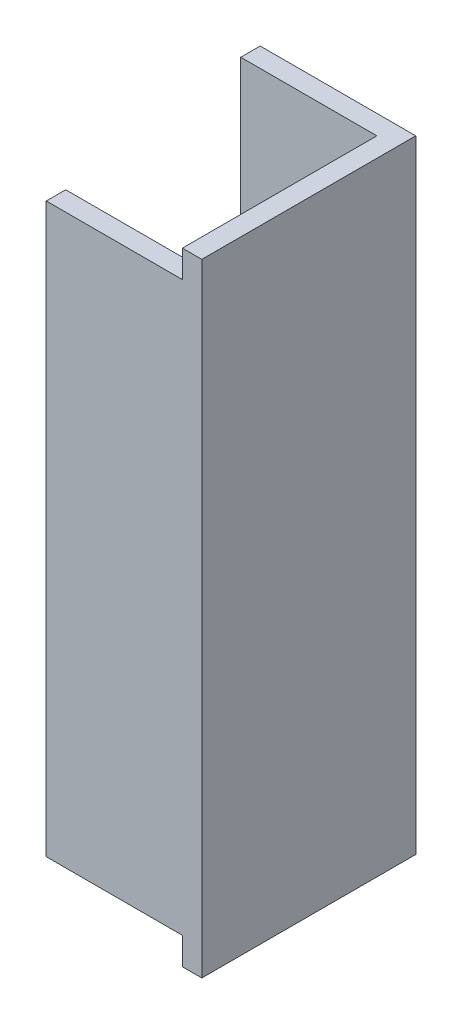
ISO-10303-21;
HEADER;
FILE_DESCRIPTION(('STEP AP214'),'2;1');
FILE_NAME('part.step','',(''),(''),'','','');
FILE_SCHEMA(('AUTOMOTIVE_DESIGN { 1 0 10303 214 1 1 1 1 }'));
ENDSEC;
DATA;
#1=APPLICATION_CONTEXT('core data for automotive mechanical design processes');
#2=APPLICATION_PROTOCOL_DEFINITION('international standard','automotive_design',2000,#1);
#3=PRODUCT_CONTEXT('',#1,'mechanical');
#4=PRODUCT('Part','Part','',(#3));
#5=PRODUCT_RELATED_PRODUCT_CATEGORY('part','',(#4));
#6=PRODUCT_DEFINITION_FORMATION('','',#4);
#7=PRODUCT_DEFINITION_CONTEXT('part definition',#1,'design');
#8=PRODUCT_DEFINITION('design','',#6,#7);
#9=PRODUCT_DEFINITION_SHAPE('','',#8);
#10=(LENGTH_UNIT() NAMED_UNIT(*) SI_UNIT(.MILLI.,.METRE.));
#11=(NAMED_UNIT(*) PLANE_ANGLE_UNIT() SI_UNIT($,.RADIAN.));
#12=(NAMED_UNIT(*) SI_UNIT($,.STERADIAN.) SOLID_ANGLE_UNIT());
#13=UNCERTAINTY_MEASURE_WITH_UNIT(LENGTH_MEASURE(1.E-05),#10,'distance_accuracy_value','');
#14=(GEOMETRIC_REPRESENTATION_CONTEXT(3) GLOBAL_UNCERTAINTY_ASSIGNED_CONTEXT((#13)) GLOBAL_UNIT_ASSIGNED_CONTEXT((#10,
#11,#12)) REPRESENTATION_CONTEXT('',''));
#15=CARTESIAN_POINT('',(0.,0.,0.));
#16=DIRECTION('',(0.,0.,1.));
#17=DIRECTION('',(1.,0.,0.));
#18=AXIS2_PLACEMENT_3D('',#15,#16,#17);
#19=CARTESIAN_POINT('',(1.55,-0.8,0.5));
#20=DIRECTION('',(0.,0.,1.));
#21=DIRECTION('',(1.,0.,0.));
#22=AXIS2_PLACEMENT_3D('',#19,#20,#21);
#23=PLANE('',#22);
#24=DIRECTION('',(0.,-1.,0.));
#25=VECTOR('',#24,1.);
#26=CARTESIAN_POINT('',(1.2,0.73,0.5));
#27=LINE('',#26,#25);
#28=CARTESIAN_POINT('',(1.2,0.73,0.5));
#29=VERTEX_POINT('',#28);
#30=CARTESIAN_POINT('',(1.2,-0.73,0.5));
#31=VERTEX_POINT('',#30);
#32=EDGE_CURVE('E11',#29,#31,#27,.T.);
#33=ORIENTED_EDGE('',*,*,#32,.F.);
#34=DIRECTION('',(1.,0.,0.));
#35=VECTOR('',#34,1.);
#36=CARTESIAN_POINT('',(1.2,0.73,0.5));
#37=LINE('',#36,#35);
#38=CARTESIAN_POINT('',(1.55,0.73,0.5));
#39=VERTEX_POINT('',#38);
#40=EDGE_CURVE('E183',#29,#39,#37,.T.);
#41=ORIENTED_EDGE('',*,*,#40,.T.);
#42=DIRECTION('',(0.,-1.,0.));
#43=VECTOR('',#42,1.);
#44=CARTESIAN_POINT('',(1.55,0.73,0.5));
#45=LINE('',#44,#43);
#46=CARTESIAN_POINT('',(1.55,-0.73,0.5));
#47=VERTEX_POINT('',#46);
#48=EDGE_CURVE('E133',#39,#47,#45,.T.);
#49=ORIENTED_EDGE('',*,*,#48,.T.);
#50=DIRECTION('',(-1.,0.,0.));
#51=VECTOR('',#50,1.);
#52=CARTESIAN_POINT('',(1.55,-0.73,0.5));
#53=LINE('',#52,#51);
#54=EDGE_CURVE('E157',#47,#31,#53,.T.);
#55=ORIENTED_EDGE('',*,*,#54,.T.);
#56=EDGE_LOOP('',(#33,#41,#49,#55));
#57=FACE_BOUND('',#56,.T.);
#58=ADVANCED_FACE('F17',(#57),#23,.F.);
#59=CARTESIAN_POINT('',(1.2,-0.8,0.5));
#60=DIRECTION('',(-1.,0.,0.));
#61=DIRECTION('',(0.,0.,1.));
#62=AXIS2_PLACEMENT_3D('',#59,#60,#61);
#63=PLANE('',#62);
#64=DIRECTION('',(0.,0.,-1.));
#65=VECTOR('',#64,1.);
#66=CARTESIAN_POINT('',(1.2,-0.73,0.55));
#67=LINE('',#66,#65);
#68=CARTESIAN_POINT('',(1.2,-0.73,0.55));
#69=VERTEX_POINT('',#68);
#70=EDGE_CURVE('E239',#69,#31,#67,.T.);
#71=ORIENTED_EDGE('',*,*,#70,.F.);
#72=DIRECTION('',(0.,-1.,0.));
#73=VECTOR('',#72,1.);
#74=CARTESIAN_POINT('',(1.2,0.73,0.55));
#75=LINE('',#74,#73);
#76=CARTESIAN_POINT('',(1.2,0.73,0.55));
#77=VERTEX_POINT('',#76);
#78=EDGE_CURVE('E179',#77,#69,#75,.T.);
#79=ORIENTED_EDGE('',*,*,#78,.F.);
#80=DIRECTION('',(0.,0.,-1.));
#81=VECTOR('',#80,1.);
#82=CARTESIAN_POINT('',(1.2,0.73,0.55));
#83=LINE('',#82,#81);
#84=EDGE_CURVE('E26',#77,#29,#83,.T.);
#85=ORIENTED_EDGE('',*,*,#84,.T.);
#86=ORIENTED_EDGE('',*,*,#32,.T.);
#87=EDGE_LOOP('',(#71,#79,#85,#86));
#88=FACE_BOUND('',#87,.T.);
#89=ADVANCED_FACE('F19',(#88),#63,.T.);
#90=CARTESIAN_POINT('',(1.2,0.73,0.5));
#91=DIRECTION('',(0.,-1.,0.));
#92=DIRECTION('',(0.,0.,-1.));
#93=AXIS2_PLACEMENT_3D('',#90,#91,#92);
#94=PLANE('',#93);
#95=DIRECTION('',(1.,0.,0.));
#96=VECTOR('',#95,1.);
#97=CARTESIAN_POINT('',(1.2,0.73,0.55));
#98=LINE('',#97,#96);
#99=CARTESIAN_POINT('',(1.55,0.73,0.55));
#100=VERTEX_POINT('',#99);
#101=EDGE_CURVE('E177',#77,#100,#98,.T.);
#102=ORIENTED_EDGE('',*,*,#101,.T.);
#103=DIRECTION('',(0.,0.,-1.));
#104=VECTOR('',#103,1.);
#105=CARTESIAN_POINT('',(1.55,0.73,0.55));
#106=LINE('',#105,#104);
#107=EDGE_CURVE('E164',#100,#39,#106,.T.);
#108=ORIENTED_EDGE('',*,*,#107,.T.);
#109=ORIENTED_EDGE('',*,*,#40,.F.);
#110=ORIENTED_EDGE('',*,*,#84,.F.);
#111=EDGE_LOOP('',(#102,#108,#109,#110));
#112=FACE_BOUND('',#111,.T.);
#113=ADVANCED_FACE('F270',(#112),#94,.F.);
#114=CARTESIAN_POINT('',(1.2,-0.8,0.05));
#115=DIRECTION('',(1.,0.,0.));
#116=DIRECTION('',(0.,1.,0.));
#117=AXIS2_PLACEMENT_3D('',#114,#115,#116);
#118=PLANE('',#117);
#119=DIRECTION('',(0.,0.,1.));
#120=VECTOR('',#119,1.);
#121=CARTESIAN_POINT('',(1.2,0.8,0.));
#122=LINE('',#121,#120);
#123=CARTESIAN_POINT('',(1.2,0.8,0.));
#124=VERTEX_POINT('',#123);
#125=CARTESIAN_POINT('',(1.2,0.8,0.05));
#126=VERTEX_POINT('',#125);
#127=EDGE_CURVE('E191',#124,#126,#122,.T.);
#128=ORIENTED_EDGE('',*,*,#127,.F.);
#129=DIRECTION('',(0.,-1.,0.));
#130=VECTOR('',#129,1.);
#131=CARTESIAN_POINT('',(1.2,0.8,0.));
#132=LINE('',#131,#130);
#133=CARTESIAN_POINT('',(1.2,-0.8,0.));
#134=VERTEX_POINT('',#133);
#135=EDGE_CURVE('E186',#124,#134,#132,.T.);
#136=ORIENTED_EDGE('',*,*,#135,.T.);
#137=DIRECTION('',(0.,0.,1.));
#138=VECTOR('',#137,1.);
#139=CARTESIAN_POINT('',(1.2,-0.8,0.));
#140=LINE('',#139,#138);
#141=CARTESIAN_POINT('',(1.2,-0.8,0.05));
#142=VERTEX_POINT('',#141);
#143=EDGE_CURVE('E209',#134,#142,#140,.T.);
#144=ORIENTED_EDGE('',*,*,#143,.T.);
#145=DIRECTION('',(0.,-1.,0.));
#146=VECTOR('',#145,1.);
#147=CARTESIAN_POINT('',(1.2,0.8,0.05));
#148=LINE('',#147,#146);
#149=EDGE_CURVE('E202',#126,#142,#148,.T.);
#150=ORIENTED_EDGE('',*,*,#149,.F.);
#151=EDGE_LOOP('',(#128,#136,#144,#150));
#152=FACE_BOUND('',#151,.T.);
#153=ADVANCED_FACE('F223',(#152),#118,.F.);
#154=CARTESIAN_POINT('',(1.2,-0.8,0.));
#155=DIRECTION('',(0.,0.,-1.));
#156=DIRECTION('',(0.,-1.,0.));
#157=AXIS2_PLACEMENT_3D('',#154,#155,#156);
#158=PLANE('',#157);
#159=DIRECTION('',(-1.,0.,0.));
#160=VECTOR('',#159,1.);
#161=CARTESIAN_POINT('',(1.6,0.8,0.));
#162=LINE('',#161,#160);
#163=CARTESIAN_POINT('',(1.6,0.8,0.));
#164=VERTEX_POINT('',#163);
#165=EDGE_CURVE('E190',#164,#124,#162,.T.);
#166=ORIENTED_EDGE('',*,*,#165,.F.);
#167=DIRECTION('',(0.,-1.,0.));
#168=VECTOR('',#167,1.);
#169=CARTESIAN_POINT('',(1.6,0.8,0.));
#170=LINE('',#169,#168);
#171=CARTESIAN_POINT('',(1.6,-0.8,0.));
#172=VERTEX_POINT('',#171);
#173=EDGE_CURVE('E46',#164,#172,#170,.T.);
#174=ORIENTED_EDGE('',*,*,#173,.T.);
#175=DIRECTION('',(-1.,0.,0.));
#176=VECTOR('',#175,1.);
#177=CARTESIAN_POINT('',(1.6,-0.8,0.));
#178=LINE('',#177,#176);
#179=EDGE_CURVE('E212',#172,#134,#178,.T.);
#180=ORIENTED_EDGE('',*,*,#179,.T.);
#181=ORIENTED_EDGE('',*,*,#135,.F.);
#182=EDGE_LOOP('',(#166,#174,#180,#181));
#183=FACE_BOUND('',#182,.T.);
#184=ADVANCED_FACE('F225',(#183),#158,.T.);
#185=CARTESIAN_POINT('',(1.6,-0.8,0.05));
#186=DIRECTION('',(1.,0.,0.));
#187=DIRECTION('',(0.,1.,0.));
#188=AXIS2_PLACEMENT_3D('',#185,#186,#187);
#189=PLANE('',#188);
#190=DIRECTION('',(0.,0.,-1.));
#191=VECTOR('',#190,1.);
#192=CARTESIAN_POINT('',(1.6,0.8,0.55));
#193=LINE('',#192,#191);
#194=CARTESIAN_POINT('',(1.6,0.8,0.55));
#195=VERTEX_POINT('',#194);
#196=EDGE_CURVE('E168',#195,#164,#193,.T.);
#197=ORIENTED_EDGE('',*,*,#196,.F.);
#198=DIRECTION('',(0.,-1.,0.));
#199=VECTOR('',#198,1.);
#200=CARTESIAN_POINT('',(1.6,0.8,0.55));
#201=LINE('',#200,#199);
#202=CARTESIAN_POINT('',(1.6,-0.8,0.55));
#203=VERTEX_POINT('',#202);
#204=EDGE_CURVE('E144',#195,#203,#201,.T.);
#205=ORIENTED_EDGE('',*,*,#204,.T.);
#206=DIRECTION('',(0.,0.,-1.));
#207=VECTOR('',#206,1.);
#208=CARTESIAN_POINT('',(1.6,-0.8,0.55));
#209=LINE('',#208,#207);
#210=EDGE_CURVE('E139',#203,#172,#209,.T.);
#211=ORIENTED_EDGE('',*,*,#210,.T.);
#212=ORIENTED_EDGE('',*,*,#173,.F.);
#213=EDGE_LOOP('',(#197,#205,#211,#212));
#214=FACE_BOUND('',#213,.T.);
#215=ADVANCED_FACE('F232',(#214),#189,.T.);
#216=CARTESIAN_POINT('',(1.55,-0.8,0.5));
#217=DIRECTION('',(0.,-1.,0.));
#218=DIRECTION('',(0.,0.,-1.));
#219=AXIS2_PLACEMENT_3D('',#216,#217,#218);
#220=PLANE('',#219);
#221=DIRECTION('',(0.,0.,-1.));
#222=VECTOR('',#221,1.);
#223=CARTESIAN_POINT('',(1.55,-0.8,0.55));
#224=LINE('',#223,#222);
#225=CARTESIAN_POINT('',(1.55,-0.8,0.55));
#226=VERTEX_POINT('',#225);
#227=CARTESIAN_POINT('',(1.55,-0.8,0.05));
#228=VERTEX_POINT('',#227);
#229=EDGE_CURVE('E120',#226,#228,#224,.T.);
#230=ORIENTED_EDGE('',*,*,#229,.T.);
#231=DIRECTION('',(-1.,0.,0.));
#232=VECTOR('',#231,1.);
#233=CARTESIAN_POINT('',(1.55,-0.8,0.05));
#234=LINE('',#233,#232);
#235=EDGE_CURVE('E206',#228,#142,#234,.T.);
#236=ORIENTED_EDGE('',*,*,#235,.T.);
#237=ORIENTED_EDGE('',*,*,#143,.F.);
#238=ORIENTED_EDGE('',*,*,#179,.F.);
#239=ORIENTED_EDGE('',*,*,#210,.F.);
#240=DIRECTION('',(1.,0.,0.));
#241=VECTOR('',#240,1.);
#242=CARTESIAN_POINT('',(1.55,-0.8,0.55));
#243=LINE('',#242,#241);
#244=EDGE_CURVE('E136',#226,#203,#243,.T.);
#245=ORIENTED_EDGE('',*,*,#244,.F.);
#246=EDGE_LOOP('',(#230,#236,#237,#238,#239,#245));
#247=FACE_BOUND('',#246,.T.);
#248=ADVANCED_FACE('F137',(#247),#220,.T.);
#249=CARTESIAN_POINT('',(1.2,-0.8,0.05));
#250=DIRECTION('',(0.,0.,-1.));
#251=DIRECTION('',(0.,-1.,0.));
#252=AXIS2_PLACEMENT_3D('',#249,#250,#251);
#253=PLANE('',#252);
#254=DIRECTION('',(-1.,0.,0.));
#255=VECTOR('',#254,1.);
#256=CARTESIAN_POINT('',(1.55,0.8,0.05));
#257=LINE('',#256,#255);
#258=CARTESIAN_POINT('',(1.55,0.8,0.05));
#259=VERTEX_POINT('',#258);
#260=EDGE_CURVE('E195',#259,#126,#257,.T.);
#261=ORIENTED_EDGE('',*,*,#260,.T.);
#262=ORIENTED_EDGE('',*,*,#149,.T.);
#263=ORIENTED_EDGE('',*,*,#235,.F.);
#264=DIRECTION('',(0.,-1.,0.));
#265=VECTOR('',#264,1.);
#266=CARTESIAN_POINT('',(1.55,0.8,0.05));
#267=LINE('',#266,#265);
#268=EDGE_CURVE('E129',#259,#228,#267,.T.);
#269=ORIENTED_EDGE('',*,*,#268,.F.);
#270=EDGE_LOOP('',(#261,#262,#263,#269));
#271=FACE_BOUND('',#270,.T.);
#272=ADVANCED_FACE('F227',(#271),#253,.F.);
#273=CARTESIAN_POINT('',(1.55,0.8,0.05));
#274=DIRECTION('',(0.,-1.,0.));
#275=DIRECTION('',(0.,0.,-1.));
#276=AXIS2_PLACEMENT_3D('',#273,#274,#275);
#277=PLANE('',#276);
#278=DIRECTION('',(1.,0.,0.));
#279=VECTOR('',#278,1.);
#280=CARTESIAN_POINT('',(1.55,0.8,0.55));
#281=LINE('',#280,#279);
#282=CARTESIAN_POINT('',(1.55,0.8,0.55));
#283=VERTEX_POINT('',#282);
#284=EDGE_CURVE('E169',#283,#195,#281,.T.);
#285=ORIENTED_EDGE('',*,*,#284,.T.);
#286=ORIENTED_EDGE('',*,*,#196,.T.);
#287=ORIENTED_EDGE('',*,*,#165,.T.);
#288=ORIENTED_EDGE('',*,*,#127,.T.);
#289=ORIENTED_EDGE('',*,*,#260,.F.);
#290=DIRECTION('',(0.,0.,-1.));
#291=VECTOR('',#290,1.);
#292=CARTESIAN_POINT('',(1.55,0.8,0.55));
#293=LINE('',#292,#291);
#294=EDGE_CURVE('E163',#283,#259,#293,.T.);
#295=ORIENTED_EDGE('',*,*,#294,.F.);
#296=EDGE_LOOP('',(#285,#286,#287,#288,#289,#295));
#297=FACE_BOUND('',#296,.T.);
#298=ADVANCED_FACE('F229',(#297),#277,.F.);
#299=CARTESIAN_POINT('',(1.55,-0.8,0.05));
#300=DIRECTION('',(1.,0.,0.));
#301=DIRECTION('',(0.,1.,0.));
#302=AXIS2_PLACEMENT_3D('',#299,#300,#301);
#303=PLANE('',#302);
#304=ORIENTED_EDGE('',*,*,#294,.T.);
#305=ORIENTED_EDGE('',*,*,#268,.T.);
#306=ORIENTED_EDGE('',*,*,#229,.F.);
#307=DIRECTION('',(0.,1.,0.));
#308=VECTOR('',#307,1.);
#309=CARTESIAN_POINT('',(1.55,-0.8,0.55));
#310=LINE('',#309,#308);
#311=CARTESIAN_POINT('',(1.55,-0.73,0.55));
#312=VERTEX_POINT('',#311);
#313=EDGE_CURVE('E126',#226,#312,#310,.T.);
#314=ORIENTED_EDGE('',*,*,#313,.T.);
#315=DIRECTION('',(0.,0.,-1.));
#316=VECTOR('',#315,1.);
#317=CARTESIAN_POINT('',(1.55,-0.73,0.55));
#318=LINE('',#317,#316);
#319=EDGE_CURVE('E151',#312,#47,#318,.T.);
#320=ORIENTED_EDGE('',*,*,#319,.T.);
#321=ORIENTED_EDGE('',*,*,#48,.F.);
#322=ORIENTED_EDGE('',*,*,#107,.F.);
#323=DIRECTION('',(0.,1.,0.));
#324=VECTOR('',#323,1.);
#325=CARTESIAN_POINT('',(1.55,0.73,0.55));
#326=LINE('',#325,#324);
#327=EDGE_CURVE('E173',#100,#283,#326,.T.);
#328=ORIENTED_EDGE('',*,*,#327,.T.);
#329=EDGE_LOOP('',(#304,#305,#306,#314,#320,#321,#322,#328));
#330=FACE_BOUND('',#329,.T.);
#331=ADVANCED_FACE('F123',(#330),#303,.F.);
#332=CARTESIAN_POINT('',(1.55,-0.8,0.55));
#333=DIRECTION('',(0.,0.,1.));
#334=DIRECTION('',(1.,0.,0.));
#335=AXIS2_PLACEMENT_3D('',#332,#333,#334);
#336=PLANE('',#335);
#337=ORIENTED_EDGE('',*,*,#313,.F.);
#338=ORIENTED_EDGE('',*,*,#244,.T.);
#339=ORIENTED_EDGE('',*,*,#204,.F.);
#340=ORIENTED_EDGE('',*,*,#284,.F.);
#341=ORIENTED_EDGE('',*,*,#327,.F.);
#342=ORIENTED_EDGE('',*,*,#101,.F.);
#343=ORIENTED_EDGE('',*,*,#78,.T.);
#344=DIRECTION('',(-1.,0.,0.));
#345=VECTOR('',#344,1.);
#346=CARTESIAN_POINT('',(1.55,-0.73,0.55));
#347=LINE('',#346,#345);
#348=EDGE_CURVE('E149',#312,#69,#347,.T.);
#349=ORIENTED_EDGE('',*,*,#348,.F.);
#350=EDGE_LOOP('',(#337,#338,#339,#340,#341,#342,#343,#349));
#351=FACE_BOUND('',#350,.T.);
#352=ADVANCED_FACE('F147',(#351),#336,.T.);
#353=CARTESIAN_POINT('',(1.2,-0.73,0.5));
#354=DIRECTION('',(0.,1.,0.));
#355=DIRECTION('',(1.,0.,0.));
#356=AXIS2_PLACEMENT_3D('',#353,#354,#355);
#357=PLANE('',#356);
#358=ORIENTED_EDGE('',*,*,#348,.T.);
#359=ORIENTED_EDGE('',*,*,#70,.T.);
#360=ORIENTED_EDGE('',*,*,#54,.F.);
#361=ORIENTED_EDGE('',*,*,#319,.F.);
#362=EDGE_LOOP('',(#358,#359,#360,#361));
#363=FACE_BOUND('',#362,.T.);
#364=ADVANCED_FACE('F266',(#363),#357,.F.);
#365=CLOSED_SHELL('',(#58,#89,#113,#153,#184,#215,#248,#272,#298,#331,#352,#364));
#366=MANIFOLD_SOLID_BREP('B1',#365);
#367=ADVANCED_BREP_SHAPE_REPRESENTATION('',(#18,#366),#14);
#368=SHAPE_DEFINITION_REPRESENTATION(#9,#367);
ENDSEC;
END-ISO-10303-21;
